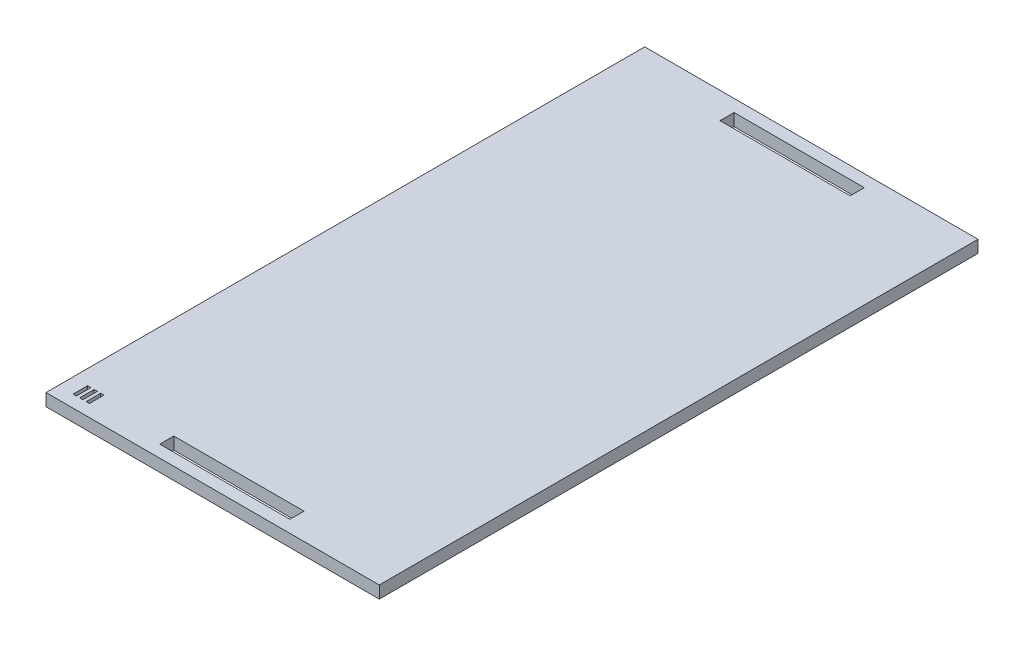
ISO-10303-21;
HEADER;
FILE_DESCRIPTION(('STEP AP214'),'2;1');
FILE_NAME('part.step','',(''),(''),'','','');
FILE_SCHEMA(('AUTOMOTIVE_DESIGN { 1 0 10303 214 1 1 1 1 }'));
ENDSEC;
DATA;
#1=APPLICATION_CONTEXT('core data for automotive mechanical design processes');
#2=APPLICATION_PROTOCOL_DEFINITION('international standard','automotive_design',2000,#1);
#3=PRODUCT_CONTEXT('',#1,'mechanical');
#4=PRODUCT('Part','Part','',(#3));
#5=PRODUCT_RELATED_PRODUCT_CATEGORY('part','',(#4));
#6=PRODUCT_DEFINITION_FORMATION('','',#4);
#7=PRODUCT_DEFINITION_CONTEXT('part definition',#1,'design');
#8=PRODUCT_DEFINITION('design','',#6,#7);
#9=PRODUCT_DEFINITION_SHAPE('','',#8);
#10=(LENGTH_UNIT() NAMED_UNIT(*) SI_UNIT(.MILLI.,.METRE.));
#11=(NAMED_UNIT(*) PLANE_ANGLE_UNIT() SI_UNIT($,.RADIAN.));
#12=(NAMED_UNIT(*) SI_UNIT($,.STERADIAN.) SOLID_ANGLE_UNIT());
#13=UNCERTAINTY_MEASURE_WITH_UNIT(LENGTH_MEASURE(1.E-05),#10,'distance_accuracy_value','');
#14=(GEOMETRIC_REPRESENTATION_CONTEXT(3) GLOBAL_UNCERTAINTY_ASSIGNED_CONTEXT((#13)) GLOBAL_UNIT_ASSIGNED_CONTEXT((#10,
#11,#12)) REPRESENTATION_CONTEXT('',''));
#15=CARTESIAN_POINT('',(0.,0.,0.));
#16=DIRECTION('',(0.,0.,1.));
#17=DIRECTION('',(1.,0.,0.));
#18=AXIS2_PLACEMENT_3D('',#15,#16,#17);
#19=CARTESIAN_POINT('',(0.,2.9972,66.4972));
#20=DIRECTION('',(0.,0.,-1.));
#21=DIRECTION('',(-1.,0.,0.));
#22=AXIS2_PLACEMENT_3D('',#19,#20,#21);
#23=PLANE('',#22);
#24=DIRECTION('',(1.,0.,0.));
#25=VECTOR('',#24,1.);
#26=CARTESIAN_POINT('',(0.,0.,66.4972));
#27=LINE('',#26,#25);
#28=CARTESIAN_POINT('',(-33.8386367698087,0.,66.4972));
#29=VERTEX_POINT('',#28);
#30=CARTESIAN_POINT('',(-33.0448867698086,0.,66.4972));
#31=VERTEX_POINT('',#30);
#32=EDGE_CURVE('E317',#29,#31,#27,.T.);
#33=ORIENTED_EDGE('',*,*,#32,.T.);
#34=DIRECTION('',(0.,-1.,0.));
#35=VECTOR('',#34,1.);
#36=CARTESIAN_POINT('',(-33.0448867698086,2.9972,66.4972));
#37=LINE('',#36,#35);
#38=CARTESIAN_POINT('',(-33.0448867698086,2.9972,66.4972));
#39=VERTEX_POINT('',#38);
#40=EDGE_CURVE('E11',#39,#31,#37,.T.);
#41=ORIENTED_EDGE('',*,*,#40,.F.);
#42=DIRECTION('',(1.,0.,0.));
#43=VECTOR('',#42,1.);
#44=CARTESIAN_POINT('',(0.,2.9972,66.4972));
#45=LINE('',#44,#43);
#46=CARTESIAN_POINT('',(-33.8386367698087,2.9972,66.4972));
#47=VERTEX_POINT('',#46);
#48=EDGE_CURVE('E217',#47,#39,#45,.T.);
#49=ORIENTED_EDGE('',*,*,#48,.F.);
#50=DIRECTION('',(0.,-1.,0.));
#51=VECTOR('',#50,1.);
#52=CARTESIAN_POINT('',(-33.8386367698087,2.9972,66.4972));
#53=LINE('',#52,#51);
#54=EDGE_CURVE('E61',#47,#29,#53,.T.);
#55=ORIENTED_EDGE('',*,*,#54,.T.);
#56=EDGE_LOOP('',(#33,#41,#49,#55));
#57=FACE_BOUND('',#56,.T.);
#58=ADVANCED_FACE('F41',(#57),#23,.F.);
#59=CARTESIAN_POINT('',(-33.0448867698086,2.9972,0.));
#60=DIRECTION('',(1.,0.,0.));
#61=DIRECTION('',(0.,0.,-1.));
#62=AXIS2_PLACEMENT_3D('',#59,#60,#61);
#63=PLANE('',#62);
#64=DIRECTION('',(0.,0.,1.));
#65=VECTOR('',#64,1.);
#66=CARTESIAN_POINT('',(-33.0448867698086,0.,0.));
#67=LINE('',#66,#65);
#68=CARTESIAN_POINT('',(-33.0448867698086,0.,70.0532));
#69=VERTEX_POINT('',#68);
#70=EDGE_CURVE('E224',#31,#69,#67,.T.);
#71=ORIENTED_EDGE('',*,*,#70,.T.);
#72=DIRECTION('',(0.,-1.,0.));
#73=VECTOR('',#72,1.);
#74=CARTESIAN_POINT('',(-33.0448867698086,2.9972,70.0532));
#75=LINE('',#74,#73);
#76=CARTESIAN_POINT('',(-33.0448867698086,2.9972,70.0532));
#77=VERTEX_POINT('',#76);
#78=EDGE_CURVE('E52',#77,#69,#75,.T.);
#79=ORIENTED_EDGE('',*,*,#78,.F.);
#80=DIRECTION('',(0.,0.,1.));
#81=VECTOR('',#80,1.);
#82=CARTESIAN_POINT('',(-33.0448867698086,2.9972,0.));
#83=LINE('',#82,#81);
#84=EDGE_CURVE('E211',#39,#77,#83,.T.);
#85=ORIENTED_EDGE('',*,*,#84,.F.);
#86=ORIENTED_EDGE('',*,*,#40,.T.);
#87=EDGE_LOOP('',(#71,#79,#85,#86));
#88=FACE_BOUND('',#87,.T.);
#89=ADVANCED_FACE('F223',(#88),#63,.F.);
#90=CARTESIAN_POINT('',(0.,2.9972,70.0532));
#91=DIRECTION('',(0.,0.,-1.));
#92=DIRECTION('',(-1.,0.,0.));
#93=AXIS2_PLACEMENT_3D('',#90,#91,#92);
#94=PLANE('',#93);
#95=DIRECTION('',(1.,0.,0.));
#96=VECTOR('',#95,1.);
#97=CARTESIAN_POINT('',(0.,0.,70.0532));
#98=LINE('',#97,#96);
#99=CARTESIAN_POINT('',(-33.8386367698087,0.,70.0532));
#100=VERTEX_POINT('',#99);
#101=EDGE_CURVE('E322',#100,#69,#98,.T.);
#102=ORIENTED_EDGE('',*,*,#101,.F.);
#103=DIRECTION('',(0.,-1.,0.));
#104=VECTOR('',#103,1.);
#105=CARTESIAN_POINT('',(-33.8386367698087,2.9972,70.0532));
#106=LINE('',#105,#104);
#107=CARTESIAN_POINT('',(-33.8386367698087,2.9972,70.0532));
#108=VERTEX_POINT('',#107);
#109=EDGE_CURVE('E135',#108,#100,#106,.T.);
#110=ORIENTED_EDGE('',*,*,#109,.F.);
#111=DIRECTION('',(1.,0.,0.));
#112=VECTOR('',#111,1.);
#113=CARTESIAN_POINT('',(0.,2.9972,70.0532));
#114=LINE('',#113,#112);
#115=EDGE_CURVE('E216',#108,#77,#114,.T.);
#116=ORIENTED_EDGE('',*,*,#115,.T.);
#117=ORIENTED_EDGE('',*,*,#78,.T.);
#118=EDGE_LOOP('',(#102,#110,#116,#117));
#119=FACE_BOUND('',#118,.T.);
#120=ADVANCED_FACE('F229',(#119),#94,.T.);
#121=CARTESIAN_POINT('',(0.,2.9972,66.4972));
#122=DIRECTION('',(0.,0.,-1.));
#123=DIRECTION('',(-1.,0.,0.));
#124=AXIS2_PLACEMENT_3D('',#121,#122,#123);
#125=PLANE('',#124);
#126=DIRECTION('',(1.,0.,0.));
#127=VECTOR('',#126,1.);
#128=CARTESIAN_POINT('',(0.,0.,66.4972));
#129=LINE('',#128,#127);
#130=CARTESIAN_POINT('',(-37.0136367698087,0.,66.4972));
#131=VERTEX_POINT('',#130);
#132=CARTESIAN_POINT('',(-36.2198867698087,0.,66.4972));
#133=VERTEX_POINT('',#132);
#134=EDGE_CURVE('E301',#131,#133,#129,.T.);
#135=ORIENTED_EDGE('',*,*,#134,.T.);
#136=DIRECTION('',(0.,-1.,0.));
#137=VECTOR('',#136,1.);
#138=CARTESIAN_POINT('',(-36.2198867698087,2.9972,66.4972));
#139=LINE('',#138,#137);
#140=CARTESIAN_POINT('',(-36.2198867698087,2.9972,66.4972));
#141=VERTEX_POINT('',#140);
#142=EDGE_CURVE('E332',#141,#133,#139,.T.);
#143=ORIENTED_EDGE('',*,*,#142,.F.);
#144=DIRECTION('',(1.,0.,0.));
#145=VECTOR('',#144,1.);
#146=CARTESIAN_POINT('',(0.,2.9972,66.4972));
#147=LINE('',#146,#145);
#148=CARTESIAN_POINT('',(-37.0136367698087,2.9972,66.4972));
#149=VERTEX_POINT('',#148);
#150=EDGE_CURVE('E467',#149,#141,#147,.T.);
#151=ORIENTED_EDGE('',*,*,#150,.F.);
#152=DIRECTION('',(0.,-1.,0.));
#153=VECTOR('',#152,1.);
#154=CARTESIAN_POINT('',(-37.0136367698087,2.9972,66.4972));
#155=LINE('',#154,#153);
#156=EDGE_CURVE('E335',#149,#131,#155,.T.);
#157=ORIENTED_EDGE('',*,*,#156,.T.);
#158=EDGE_LOOP('',(#135,#143,#151,#157));
#159=FACE_BOUND('',#158,.T.);
#160=ADVANCED_FACE('F498',(#159),#125,.F.);
#161=CARTESIAN_POINT('',(-36.2198867698087,2.9972,0.));
#162=DIRECTION('',(1.,0.,0.));
#163=DIRECTION('',(0.,0.,-1.));
#164=AXIS2_PLACEMENT_3D('',#161,#162,#163);
#165=PLANE('',#164);
#166=DIRECTION('',(0.,0.,1.));
#167=VECTOR('',#166,1.);
#168=CARTESIAN_POINT('',(-36.2198867698087,0.,0.));
#169=LINE('',#168,#167);
#170=CARTESIAN_POINT('',(-36.2198867698087,0.,70.0532));
#171=VERTEX_POINT('',#170);
#172=EDGE_CURVE('E305',#133,#171,#169,.T.);
#173=ORIENTED_EDGE('',*,*,#172,.T.);
#174=DIRECTION('',(0.,-1.,0.));
#175=VECTOR('',#174,1.);
#176=CARTESIAN_POINT('',(-36.2198867698087,2.9972,70.0532));
#177=LINE('',#176,#175);
#178=CARTESIAN_POINT('',(-36.2198867698087,2.9972,70.0532));
#179=VERTEX_POINT('',#178);
#180=EDGE_CURVE('E342',#179,#171,#177,.T.);
#181=ORIENTED_EDGE('',*,*,#180,.F.);
#182=DIRECTION('',(0.,0.,1.));
#183=VECTOR('',#182,1.);
#184=CARTESIAN_POINT('',(-36.2198867698087,2.9972,0.));
#185=LINE('',#184,#183);
#186=EDGE_CURVE('E471',#141,#179,#185,.T.);
#187=ORIENTED_EDGE('',*,*,#186,.F.);
#188=ORIENTED_EDGE('',*,*,#142,.T.);
#189=EDGE_LOOP('',(#173,#181,#187,#188));
#190=FACE_BOUND('',#189,.T.);
#191=ADVANCED_FACE('F500',(#190),#165,.F.);
#192=CARTESIAN_POINT('',(0.,2.9972,70.0532));
#193=DIRECTION('',(0.,0.,-1.));
#194=DIRECTION('',(-1.,0.,0.));
#195=AXIS2_PLACEMENT_3D('',#192,#193,#194);
#196=PLANE('',#195);
#197=DIRECTION('',(1.,0.,0.));
#198=VECTOR('',#197,1.);
#199=CARTESIAN_POINT('',(0.,0.,70.0532));
#200=LINE('',#199,#198);
#201=CARTESIAN_POINT('',(-37.0136367698087,0.,70.0532));
#202=VERTEX_POINT('',#201);
#203=EDGE_CURVE('E309',#202,#171,#200,.T.);
#204=ORIENTED_EDGE('',*,*,#203,.F.);
#205=DIRECTION('',(0.,-1.,0.));
#206=VECTOR('',#205,1.);
#207=CARTESIAN_POINT('',(-37.0136367698087,2.9972,70.0532));
#208=LINE('',#207,#206);
#209=CARTESIAN_POINT('',(-37.0136367698087,2.9972,70.0532));
#210=VERTEX_POINT('',#209);
#211=EDGE_CURVE('E338',#210,#202,#208,.T.);
#212=ORIENTED_EDGE('',*,*,#211,.F.);
#213=DIRECTION('',(1.,0.,0.));
#214=VECTOR('',#213,1.);
#215=CARTESIAN_POINT('',(0.,2.9972,70.0532));
#216=LINE('',#215,#214);
#217=EDGE_CURVE('E474',#210,#179,#216,.T.);
#218=ORIENTED_EDGE('',*,*,#217,.T.);
#219=ORIENTED_EDGE('',*,*,#180,.T.);
#220=EDGE_LOOP('',(#204,#212,#218,#219));
#221=FACE_BOUND('',#220,.T.);
#222=ADVANCED_FACE('F493',(#221),#196,.T.);
#223=CARTESIAN_POINT('',(0.,2.9972,66.6242));
#224=DIRECTION('',(0.,0.,-1.));
#225=DIRECTION('',(-1.,0.,0.));
#226=AXIS2_PLACEMENT_3D('',#223,#224,#225);
#227=PLANE('',#226);
#228=DIRECTION('',(1.,0.,0.));
#229=VECTOR('',#228,1.);
#230=CARTESIAN_POINT('',(0.,0.,66.6242));
#231=LINE('',#230,#229);
#232=CARTESIAN_POINT('',(-15.875,0.,66.6242));
#233=VERTEX_POINT('',#232);
#234=CARTESIAN_POINT('',(15.875,0.,66.6242));
#235=VERTEX_POINT('',#234);
#236=EDGE_CURVE('E285',#233,#235,#231,.T.);
#237=ORIENTED_EDGE('',*,*,#236,.T.);
#238=DIRECTION('',(0.,-1.,0.));
#239=VECTOR('',#238,1.);
#240=CARTESIAN_POINT('',(15.875,2.9972,66.6242));
#241=LINE('',#240,#239);
#242=CARTESIAN_POINT('',(15.875,2.9972,66.6242));
#243=VERTEX_POINT('',#242);
#244=EDGE_CURVE('E339',#243,#235,#241,.T.);
#245=ORIENTED_EDGE('',*,*,#244,.F.);
#246=DIRECTION('',(1.,0.,0.));
#247=VECTOR('',#246,1.);
#248=CARTESIAN_POINT('',(0.,2.9972,66.6242));
#249=LINE('',#248,#247);
#250=CARTESIAN_POINT('',(-15.875,2.9972,66.6242));
#251=VERTEX_POINT('',#250);
#252=EDGE_CURVE('E452',#251,#243,#249,.T.);
#253=ORIENTED_EDGE('',*,*,#252,.F.);
#254=DIRECTION('',(0.,-1.,0.));
#255=VECTOR('',#254,1.);
#256=CARTESIAN_POINT('',(-15.875,2.9972,66.6242));
#257=LINE('',#256,#255);
#258=EDGE_CURVE('E348',#251,#233,#257,.T.);
#259=ORIENTED_EDGE('',*,*,#258,.T.);
#260=EDGE_LOOP('',(#237,#245,#253,#259));
#261=FACE_BOUND('',#260,.T.);
#262=ADVANCED_FACE('F507',(#261),#227,.F.);
#263=CARTESIAN_POINT('',(15.8750000000001,2.9972,0.));
#264=DIRECTION('',(1.,0.,0.));
#265=DIRECTION('',(0.,0.,-1.));
#266=AXIS2_PLACEMENT_3D('',#263,#264,#265);
#267=PLANE('',#266);
#268=DIRECTION('',(0.,0.,1.));
#269=VECTOR('',#268,1.);
#270=CARTESIAN_POINT('',(15.8750000000001,0.,0.));
#271=LINE('',#270,#269);
#272=CARTESIAN_POINT('',(15.875,0.,70.0532));
#273=VERTEX_POINT('',#272);
#274=EDGE_CURVE('E289',#235,#273,#271,.T.);
#275=ORIENTED_EDGE('',*,*,#274,.T.);
#276=DIRECTION('',(0.,-1.,0.));
#277=VECTOR('',#276,1.);
#278=CARTESIAN_POINT('',(15.875,2.9972,70.0532));
#279=LINE('',#278,#277);
#280=CARTESIAN_POINT('',(15.875,2.9972,70.0532));
#281=VERTEX_POINT('',#280);
#282=EDGE_CURVE('E355',#281,#273,#279,.T.);
#283=ORIENTED_EDGE('',*,*,#282,.F.);
#284=DIRECTION('',(0.,0.,1.));
#285=VECTOR('',#284,1.);
#286=CARTESIAN_POINT('',(15.8750000000001,2.9972,0.));
#287=LINE('',#286,#285);
#288=EDGE_CURVE('E456',#243,#281,#287,.T.);
#289=ORIENTED_EDGE('',*,*,#288,.F.);
#290=ORIENTED_EDGE('',*,*,#244,.T.);
#291=EDGE_LOOP('',(#275,#283,#289,#290));
#292=FACE_BOUND('',#291,.T.);
#293=ADVANCED_FACE('F569',(#292),#267,.F.);
#294=CARTESIAN_POINT('',(0.,2.9972,70.0532));
#295=DIRECTION('',(0.,0.,-1.));
#296=DIRECTION('',(-1.,0.,0.));
#297=AXIS2_PLACEMENT_3D('',#294,#295,#296);
#298=PLANE('',#297);
#299=DIRECTION('',(1.,0.,0.));
#300=VECTOR('',#299,1.);
#301=CARTESIAN_POINT('',(0.,0.,70.0532));
#302=LINE('',#301,#300);
#303=CARTESIAN_POINT('',(-15.875,0.,70.0532));
#304=VERTEX_POINT('',#303);
#305=EDGE_CURVE('E293',#304,#273,#302,.T.);
#306=ORIENTED_EDGE('',*,*,#305,.F.);
#307=DIRECTION('',(0.,-1.,0.));
#308=VECTOR('',#307,1.);
#309=CARTESIAN_POINT('',(-15.875,2.9972,70.0532));
#310=LINE('',#309,#308);
#311=CARTESIAN_POINT('',(-15.875,2.9972,70.0532));
#312=VERTEX_POINT('',#311);
#313=EDGE_CURVE('E351',#312,#304,#310,.T.);
#314=ORIENTED_EDGE('',*,*,#313,.F.);
#315=DIRECTION('',(1.,0.,0.));
#316=VECTOR('',#315,1.);
#317=CARTESIAN_POINT('',(0.,2.9972,70.0532));
#318=LINE('',#317,#316);
#319=EDGE_CURVE('E459',#312,#281,#318,.T.);
#320=ORIENTED_EDGE('',*,*,#319,.T.);
#321=ORIENTED_EDGE('',*,*,#282,.T.);
#322=EDGE_LOOP('',(#306,#314,#320,#321));
#323=FACE_BOUND('',#322,.T.);
#324=ADVANCED_FACE('F556',(#323),#298,.T.);
#325=CARTESIAN_POINT('',(0.,2.9972,-70.0532));
#326=DIRECTION('',(0.,0.,-1.));
#327=DIRECTION('',(-1.,0.,0.));
#328=AXIS2_PLACEMENT_3D('',#325,#326,#327);
#329=PLANE('',#328);
#330=DIRECTION('',(1.,0.,0.));
#331=VECTOR('',#330,1.);
#332=CARTESIAN_POINT('',(0.,0.,-70.0532));
#333=LINE('',#332,#331);
#334=CARTESIAN_POINT('',(-15.875,0.,-70.0532));
#335=VERTEX_POINT('',#334);
#336=CARTESIAN_POINT('',(15.875,0.,-70.0532));
#337=VERTEX_POINT('',#336);
#338=EDGE_CURVE('E269',#335,#337,#333,.T.);
#339=ORIENTED_EDGE('',*,*,#338,.T.);
#340=DIRECTION('',(0.,-1.,0.));
#341=VECTOR('',#340,1.);
#342=CARTESIAN_POINT('',(15.875,2.9972,-70.0532));
#343=LINE('',#342,#341);
#344=CARTESIAN_POINT('',(15.875,2.9972,-70.0532));
#345=VERTEX_POINT('',#344);
#346=EDGE_CURVE('E352',#345,#337,#343,.T.);
#347=ORIENTED_EDGE('',*,*,#346,.F.);
#348=DIRECTION('',(1.,0.,0.));
#349=VECTOR('',#348,1.);
#350=CARTESIAN_POINT('',(0.,2.9972,-70.0532));
#351=LINE('',#350,#349);
#352=CARTESIAN_POINT('',(-15.875,2.9972,-70.0532));
#353=VERTEX_POINT('',#352);
#354=EDGE_CURVE('E437',#353,#345,#351,.T.);
#355=ORIENTED_EDGE('',*,*,#354,.F.);
#356=DIRECTION('',(0.,-1.,0.));
#357=VECTOR('',#356,1.);
#358=CARTESIAN_POINT('',(-15.875,2.9972,-70.0532));
#359=LINE('',#358,#357);
#360=EDGE_CURVE('E361',#353,#335,#359,.T.);
#361=ORIENTED_EDGE('',*,*,#360,.T.);
#362=EDGE_LOOP('',(#339,#347,#355,#361));
#363=FACE_BOUND('',#362,.T.);
#364=ADVANCED_FACE('F552',(#363),#329,.F.);
#365=CARTESIAN_POINT('',(15.875,2.9972,0.));
#366=DIRECTION('',(1.,0.,0.));
#367=DIRECTION('',(0.,0.,-1.));
#368=AXIS2_PLACEMENT_3D('',#365,#366,#367);
#369=PLANE('',#368);
#370=DIRECTION('',(0.,0.,1.));
#371=VECTOR('',#370,1.);
#372=CARTESIAN_POINT('',(15.875,0.,0.));
#373=LINE('',#372,#371);
#374=CARTESIAN_POINT('',(15.875,0.,-66.6242));
#375=VERTEX_POINT('',#374);
#376=EDGE_CURVE('E273',#337,#375,#373,.T.);
#377=ORIENTED_EDGE('',*,*,#376,.T.);
#378=DIRECTION('',(0.,-1.,0.));
#379=VECTOR('',#378,1.);
#380=CARTESIAN_POINT('',(15.875,2.9972,-66.6242));
#381=LINE('',#380,#379);
#382=CARTESIAN_POINT('',(15.875,2.9972,-66.6242));
#383=VERTEX_POINT('',#382);
#384=EDGE_CURVE('E368',#383,#375,#381,.T.);
#385=ORIENTED_EDGE('',*,*,#384,.F.);
#386=DIRECTION('',(0.,0.,1.));
#387=VECTOR('',#386,1.);
#388=CARTESIAN_POINT('',(15.875,2.9972,0.));
#389=LINE('',#388,#387);
#390=EDGE_CURVE('E441',#345,#383,#389,.T.);
#391=ORIENTED_EDGE('',*,*,#390,.F.);
#392=ORIENTED_EDGE('',*,*,#346,.T.);
#393=EDGE_LOOP('',(#377,#385,#391,#392));
#394=FACE_BOUND('',#393,.T.);
#395=ADVANCED_FACE('F555',(#394),#369,.F.);
#396=CARTESIAN_POINT('',(0.,2.9972,-66.6242));
#397=DIRECTION('',(0.,0.,-1.));
#398=DIRECTION('',(-1.,0.,0.));
#399=AXIS2_PLACEMENT_3D('',#396,#397,#398);
#400=PLANE('',#399);
#401=DIRECTION('',(1.,0.,0.));
#402=VECTOR('',#401,1.);
#403=CARTESIAN_POINT('',(0.,0.,-66.6242));
#404=LINE('',#403,#402);
#405=CARTESIAN_POINT('',(-15.875,0.,-66.6242));
#406=VERTEX_POINT('',#405);
#407=EDGE_CURVE('E277',#406,#375,#404,.T.);
#408=ORIENTED_EDGE('',*,*,#407,.F.);
#409=DIRECTION('',(0.,-1.,0.));
#410=VECTOR('',#409,1.);
#411=CARTESIAN_POINT('',(-15.875,2.9972,-66.6242));
#412=LINE('',#411,#410);
#413=CARTESIAN_POINT('',(-15.875,2.9972,-66.6242));
#414=VERTEX_POINT('',#413);
#415=EDGE_CURVE('E364',#414,#406,#412,.T.);
#416=ORIENTED_EDGE('',*,*,#415,.F.);
#417=DIRECTION('',(1.,0.,0.));
#418=VECTOR('',#417,1.);
#419=CARTESIAN_POINT('',(0.,2.9972,-66.6242));
#420=LINE('',#419,#418);
#421=EDGE_CURVE('E444',#414,#383,#420,.T.);
#422=ORIENTED_EDGE('',*,*,#421,.T.);
#423=ORIENTED_EDGE('',*,*,#384,.T.);
#424=EDGE_LOOP('',(#408,#416,#422,#423));
#425=FACE_BOUND('',#424,.T.);
#426=ADVANCED_FACE('F540',(#425),#400,.T.);
#427=CARTESIAN_POINT('',(-40.6471374,2.9972,0.));
#428=DIRECTION('',(-1.,0.,0.));
#429=DIRECTION('',(0.,0.,1.));
#430=AXIS2_PLACEMENT_3D('',#427,#428,#429);
#431=PLANE('',#430);
#432=DIRECTION('',(0.,0.,-1.));
#433=VECTOR('',#432,1.);
#434=CARTESIAN_POINT('',(-40.6471374,0.,0.));
#435=LINE('',#434,#433);
#436=CARTESIAN_POINT('',(-40.6471374,0.,73.025));
#437=VERTEX_POINT('',#436);
#438=CARTESIAN_POINT('',(-40.6471374,0.,-73.025));
#439=VERTEX_POINT('',#438);
#440=EDGE_CURVE('E253',#437,#439,#435,.T.);
#441=ORIENTED_EDGE('',*,*,#440,.F.);
#442=DIRECTION('',(0.,-1.,0.));
#443=VECTOR('',#442,1.);
#444=CARTESIAN_POINT('',(-40.6471374,2.9972,73.025));
#445=LINE('',#444,#443);
#446=CARTESIAN_POINT('',(-40.6471374,2.9972,73.025));
#447=VERTEX_POINT('',#446);
#448=EDGE_CURVE('E365',#447,#437,#445,.T.);
#449=ORIENTED_EDGE('',*,*,#448,.F.);
#450=DIRECTION('',(0.,0.,-1.));
#451=VECTOR('',#450,1.);
#452=CARTESIAN_POINT('',(-40.6471374,2.9972,0.));
#453=LINE('',#452,#451);
#454=CARTESIAN_POINT('',(-40.6471374,2.9972,-73.025));
#455=VERTEX_POINT('',#454);
#456=EDGE_CURVE('E416',#447,#455,#453,.T.);
#457=ORIENTED_EDGE('',*,*,#456,.T.);
#458=DIRECTION('',(0.,-1.,0.));
#459=VECTOR('',#458,1.);
#460=CARTESIAN_POINT('',(-40.6471374,2.9972,-73.025));
#461=LINE('',#460,#459);
#462=EDGE_CURVE('E374',#455,#439,#461,.T.);
#463=ORIENTED_EDGE('',*,*,#462,.T.);
#464=EDGE_LOOP('',(#441,#449,#457,#463));
#465=FACE_BOUND('',#464,.T.);
#466=ADVANCED_FACE('F536',(#465),#431,.T.);
#467=CARTESIAN_POINT('',(0.,2.9972,73.025));
#468=DIRECTION('',(0.,0.,1.));
#469=DIRECTION('',(1.,0.,0.));
#470=AXIS2_PLACEMENT_3D('',#467,#468,#469);
#471=PLANE('',#470);
#472=DIRECTION('',(-1.,0.,0.));
#473=VECTOR('',#472,1.);
#474=CARTESIAN_POINT('',(0.,0.,73.025));
#475=LINE('',#474,#473);
#476=CARTESIAN_POINT('',(40.6471374,0.,73.025));
#477=VERTEX_POINT('',#476);
#478=EDGE_CURVE('E257',#477,#437,#475,.T.);
#479=ORIENTED_EDGE('',*,*,#478,.F.);
#480=DIRECTION('',(0.,-1.,0.));
#481=VECTOR('',#480,1.);
#482=CARTESIAN_POINT('',(40.6471374,2.9972,73.025));
#483=LINE('',#482,#481);
#484=CARTESIAN_POINT('',(40.6471374,2.9972,73.025));
#485=VERTEX_POINT('',#484);
#486=EDGE_CURVE('E381',#485,#477,#483,.T.);
#487=ORIENTED_EDGE('',*,*,#486,.F.);
#488=DIRECTION('',(-1.,0.,0.));
#489=VECTOR('',#488,1.);
#490=CARTESIAN_POINT('',(0.,2.9972,73.025));
#491=LINE('',#490,#489);
#492=EDGE_CURVE('E422',#485,#447,#491,.T.);
#493=ORIENTED_EDGE('',*,*,#492,.T.);
#494=ORIENTED_EDGE('',*,*,#448,.T.);
#495=EDGE_LOOP('',(#479,#487,#493,#494));
#496=FACE_BOUND('',#495,.T.);
#497=ADVANCED_FACE('F539',(#496),#471,.T.);
#498=CARTESIAN_POINT('',(40.6471374,2.9972,0.));
#499=DIRECTION('',(-1.,0.,0.));
#500=DIRECTION('',(0.,0.,1.));
#501=AXIS2_PLACEMENT_3D('',#498,#499,#500);
#502=PLANE('',#501);
#503=DIRECTION('',(0.,0.,-1.));
#504=VECTOR('',#503,1.);
#505=CARTESIAN_POINT('',(40.6471374,0.,0.));
#506=LINE('',#505,#504);
#507=CARTESIAN_POINT('',(40.6471374,0.,-73.025));
#508=VERTEX_POINT('',#507);
#509=EDGE_CURVE('E261',#477,#508,#506,.T.);
#510=ORIENTED_EDGE('',*,*,#509,.T.);
#511=DIRECTION('',(0.,-1.,0.));
#512=VECTOR('',#511,1.);
#513=CARTESIAN_POINT('',(40.6471374,2.9972,-73.025));
#514=LINE('',#513,#512);
#515=CARTESIAN_POINT('',(40.6471374,2.9972,-73.025));
#516=VERTEX_POINT('',#515);
#517=EDGE_CURVE('E377',#516,#508,#514,.T.);
#518=ORIENTED_EDGE('',*,*,#517,.F.);
#519=DIRECTION('',(0.,0.,-1.));
#520=VECTOR('',#519,1.);
#521=CARTESIAN_POINT('',(40.6471374,2.9972,0.));
#522=LINE('',#521,#520);
#523=EDGE_CURVE('E430',#485,#516,#522,.T.);
#524=ORIENTED_EDGE('',*,*,#523,.F.);
#525=ORIENTED_EDGE('',*,*,#486,.T.);
#526=EDGE_LOOP('',(#510,#518,#524,#525));
#527=FACE_BOUND('',#526,.T.);
#528=ADVANCED_FACE('F544',(#527),#502,.F.);
#529=CARTESIAN_POINT('',(-34.6323867698087,2.9972,0.));
#530=DIRECTION('',(-1.,0.,0.));
#531=DIRECTION('',(0.,0.,1.));
#532=AXIS2_PLACEMENT_3D('',#529,#530,#531);
#533=PLANE('',#532);
#534=DIRECTION('',(0.,0.,-1.));
#535=VECTOR('',#534,1.);
#536=CARTESIAN_POINT('',(-34.6323867698087,0.,0.));
#537=LINE('',#536,#535);
#538=CARTESIAN_POINT('',(-34.6323867698087,0.,70.0532));
#539=VERTEX_POINT('',#538);
#540=CARTESIAN_POINT('',(-34.6323867698087,0.,66.4972));
#541=VERTEX_POINT('',#540);
#542=EDGE_CURVE('E238',#539,#541,#537,.T.);
#543=ORIENTED_EDGE('',*,*,#542,.F.);
#544=DIRECTION('',(0.,-1.,0.));
#545=VECTOR('',#544,1.);
#546=CARTESIAN_POINT('',(-34.6323867698087,2.9972,70.0532));
#547=LINE('',#546,#545);
#548=CARTESIAN_POINT('',(-34.6323867698087,2.9972,70.0532));
#549=VERTEX_POINT('',#548);
#550=EDGE_CURVE('E45',#549,#539,#547,.T.);
#551=ORIENTED_EDGE('',*,*,#550,.F.);
#552=DIRECTION('',(0.,0.,-1.));
#553=VECTOR('',#552,1.);
#554=CARTESIAN_POINT('',(-34.6323867698087,2.9972,0.));
#555=LINE('',#554,#553);
#556=CARTESIAN_POINT('',(-34.6323867698087,2.9972,66.4972));
#557=VERTEX_POINT('',#556);
#558=EDGE_CURVE('E329',#549,#557,#555,.T.);
#559=ORIENTED_EDGE('',*,*,#558,.T.);
#560=DIRECTION('',(0.,-1.,0.));
#561=VECTOR('',#560,1.);
#562=CARTESIAN_POINT('',(-34.6323867698087,2.9972,66.4972));
#563=LINE('',#562,#561);
#564=EDGE_CURVE('E234',#557,#541,#563,.T.);
#565=ORIENTED_EDGE('',*,*,#564,.T.);
#566=EDGE_LOOP('',(#543,#551,#559,#565));
#567=FACE_BOUND('',#566,.T.);
#568=ADVANCED_FACE('F43',(#567),#533,.T.);
#569=CARTESIAN_POINT('',(0.,2.9972,70.0532));
#570=DIRECTION('',(0.,0.,-1.));
#571=DIRECTION('',(-1.,0.,0.));
#572=AXIS2_PLACEMENT_3D('',#569,#570,#571);
#573=PLANE('',#572);
#574=DIRECTION('',(1.,0.,0.));
#575=VECTOR('',#574,1.);
#576=CARTESIAN_POINT('',(0.,0.,70.0532));
#577=LINE('',#576,#575);
#578=CARTESIAN_POINT('',(-35.4261367698087,0.,70.0532));
#579=VERTEX_POINT('',#578);
#580=EDGE_CURVE('E242',#579,#539,#577,.T.);
#581=ORIENTED_EDGE('',*,*,#580,.F.);
#582=DIRECTION('',(0.,-1.,0.));
#583=VECTOR('',#582,1.);
#584=CARTESIAN_POINT('',(-35.4261367698087,2.9972,70.0532));
#585=LINE('',#584,#583);
#586=CARTESIAN_POINT('',(-35.4261367698087,2.9972,70.0532));
#587=VERTEX_POINT('',#586);
#588=EDGE_CURVE('E391',#587,#579,#585,.T.);
#589=ORIENTED_EDGE('',*,*,#588,.F.);
#590=DIRECTION('',(1.,0.,0.));
#591=VECTOR('',#590,1.);
#592=CARTESIAN_POINT('',(0.,2.9972,70.0532));
#593=LINE('',#592,#591);
#594=EDGE_CURVE('E402',#587,#549,#593,.T.);
#595=ORIENTED_EDGE('',*,*,#594,.T.);
#596=ORIENTED_EDGE('',*,*,#550,.T.);
#597=EDGE_LOOP('',(#581,#589,#595,#596));
#598=FACE_BOUND('',#597,.T.);
#599=ADVANCED_FACE('F400',(#598),#573,.T.);
#600=CARTESIAN_POINT('',(-35.4261367698087,2.9972,0.));
#601=DIRECTION('',(-1.,0.,0.));
#602=DIRECTION('',(0.,0.,1.));
#603=AXIS2_PLACEMENT_3D('',#600,#601,#602);
#604=PLANE('',#603);
#605=DIRECTION('',(0.,0.,-1.));
#606=VECTOR('',#605,1.);
#607=CARTESIAN_POINT('',(-35.4261367698087,0.,0.));
#608=LINE('',#607,#606);
#609=CARTESIAN_POINT('',(-35.4261367698087,0.,66.4972));
#610=VERTEX_POINT('',#609);
#611=EDGE_CURVE('E246',#579,#610,#608,.T.);
#612=ORIENTED_EDGE('',*,*,#611,.T.);
#613=DIRECTION('',(0.,-1.,0.));
#614=VECTOR('',#613,1.);
#615=CARTESIAN_POINT('',(-35.4261367698087,2.9972,66.4972));
#616=LINE('',#615,#614);
#617=CARTESIAN_POINT('',(-35.4261367698087,2.9972,66.4972));
#618=VERTEX_POINT('',#617);
#619=EDGE_CURVE('E388',#618,#610,#616,.T.);
#620=ORIENTED_EDGE('',*,*,#619,.F.);
#621=DIRECTION('',(0.,0.,-1.));
#622=VECTOR('',#621,1.);
#623=CARTESIAN_POINT('',(-35.4261367698087,2.9972,0.));
#624=LINE('',#623,#622);
#625=EDGE_CURVE('E417',#587,#618,#624,.T.);
#626=ORIENTED_EDGE('',*,*,#625,.F.);
#627=ORIENTED_EDGE('',*,*,#588,.T.);
#628=EDGE_LOOP('',(#612,#620,#626,#627));
#629=FACE_BOUND('',#628,.T.);
#630=ADVANCED_FACE('F409',(#629),#604,.F.);
#631=CARTESIAN_POINT('',(-37.0136367698087,2.9972,0.));
#632=DIRECTION('',(1.,0.,0.));
#633=DIRECTION('',(0.,0.,-1.));
#634=AXIS2_PLACEMENT_3D('',#631,#632,#633);
#635=PLANE('',#634);
#636=DIRECTION('',(0.,0.,1.));
#637=VECTOR('',#636,1.);
#638=CARTESIAN_POINT('',(-37.0136367698087,0.,0.));
#639=LINE('',#638,#637);
#640=EDGE_CURVE('E313',#131,#202,#639,.T.);
#641=ORIENTED_EDGE('',*,*,#640,.F.);
#642=ORIENTED_EDGE('',*,*,#156,.F.);
#643=DIRECTION('',(0.,0.,1.));
#644=VECTOR('',#643,1.);
#645=CARTESIAN_POINT('',(-37.0136367698087,2.9972,0.));
#646=LINE('',#645,#644);
#647=EDGE_CURVE('E478',#149,#210,#646,.T.);
#648=ORIENTED_EDGE('',*,*,#647,.T.);
#649=ORIENTED_EDGE('',*,*,#211,.T.);
#650=EDGE_LOOP('',(#641,#642,#648,#649));
#651=FACE_BOUND('',#650,.T.);
#652=ADVANCED_FACE('F485',(#651),#635,.T.);
#653=CARTESIAN_POINT('',(-15.8750000000001,2.9972,0.));
#654=DIRECTION('',(1.,0.,0.));
#655=DIRECTION('',(0.,0.,-1.));
#656=AXIS2_PLACEMENT_3D('',#653,#654,#655);
#657=PLANE('',#656);
#658=DIRECTION('',(0.,0.,1.));
#659=VECTOR('',#658,1.);
#660=CARTESIAN_POINT('',(-15.8750000000001,0.,0.));
#661=LINE('',#660,#659);
#662=EDGE_CURVE('E297',#233,#304,#661,.T.);
#663=ORIENTED_EDGE('',*,*,#662,.F.);
#664=ORIENTED_EDGE('',*,*,#258,.F.);
#665=DIRECTION('',(0.,0.,1.));
#666=VECTOR('',#665,1.);
#667=CARTESIAN_POINT('',(-15.8750000000001,2.9972,0.));
#668=LINE('',#667,#666);
#669=EDGE_CURVE('E463',#251,#312,#668,.T.);
#670=ORIENTED_EDGE('',*,*,#669,.T.);
#671=ORIENTED_EDGE('',*,*,#313,.T.);
#672=EDGE_LOOP('',(#663,#664,#670,#671));
#673=FACE_BOUND('',#672,.T.);
#674=ADVANCED_FACE('F519',(#673),#657,.T.);
#675=CARTESIAN_POINT('',(-15.875,2.9972,0.));
#676=DIRECTION('',(1.,0.,0.));
#677=DIRECTION('',(0.,0.,-1.));
#678=AXIS2_PLACEMENT_3D('',#675,#676,#677);
#679=PLANE('',#678);
#680=DIRECTION('',(0.,0.,1.));
#681=VECTOR('',#680,1.);
#682=CARTESIAN_POINT('',(-15.875,0.,0.));
#683=LINE('',#682,#681);
#684=EDGE_CURVE('E281',#335,#406,#683,.T.);
#685=ORIENTED_EDGE('',*,*,#684,.F.);
#686=ORIENTED_EDGE('',*,*,#360,.F.);
#687=DIRECTION('',(0.,0.,1.));
#688=VECTOR('',#687,1.);
#689=CARTESIAN_POINT('',(-15.875,2.9972,0.));
#690=LINE('',#689,#688);
#691=EDGE_CURVE('E448',#353,#414,#690,.T.);
#692=ORIENTED_EDGE('',*,*,#691,.T.);
#693=ORIENTED_EDGE('',*,*,#415,.T.);
#694=EDGE_LOOP('',(#685,#686,#692,#693));
#695=FACE_BOUND('',#694,.T.);
#696=ADVANCED_FACE('F524',(#695),#679,.T.);
#697=CARTESIAN_POINT('',(0.,2.9972,-73.025));
#698=DIRECTION('',(0.,0.,1.));
#699=DIRECTION('',(1.,0.,0.));
#700=AXIS2_PLACEMENT_3D('',#697,#698,#699);
#701=PLANE('',#700);
#702=DIRECTION('',(-1.,0.,0.));
#703=VECTOR('',#702,1.);
#704=CARTESIAN_POINT('',(0.,0.,-73.025));
#705=LINE('',#704,#703);
#706=EDGE_CURVE('E265',#508,#439,#705,.T.);
#707=ORIENTED_EDGE('',*,*,#706,.T.);
#708=ORIENTED_EDGE('',*,*,#462,.F.);
#709=DIRECTION('',(-1.,0.,0.));
#710=VECTOR('',#709,1.);
#711=CARTESIAN_POINT('',(0.,2.9972,-73.025));
#712=LINE('',#711,#710);
#713=EDGE_CURVE('E434',#516,#455,#712,.T.);
#714=ORIENTED_EDGE('',*,*,#713,.F.);
#715=ORIENTED_EDGE('',*,*,#517,.T.);
#716=EDGE_LOOP('',(#707,#708,#714,#715));
#717=FACE_BOUND('',#716,.T.);
#718=ADVANCED_FACE('F535',(#717),#701,.F.);
#719=CARTESIAN_POINT('',(0.,2.9972,66.4972));
#720=DIRECTION('',(0.,0.,-1.));
#721=DIRECTION('',(-1.,0.,0.));
#722=AXIS2_PLACEMENT_3D('',#719,#720,#721);
#723=PLANE('',#722);
#724=DIRECTION('',(1.,0.,0.));
#725=VECTOR('',#724,1.);
#726=CARTESIAN_POINT('',(0.,0.,66.4972));
#727=LINE('',#726,#725);
#728=EDGE_CURVE('E249',#610,#541,#727,.T.);
#729=ORIENTED_EDGE('',*,*,#728,.T.);
#730=ORIENTED_EDGE('',*,*,#564,.F.);
#731=DIRECTION('',(1.,0.,0.));
#732=VECTOR('',#731,1.);
#733=CARTESIAN_POINT('',(0.,2.9972,66.4972));
#734=LINE('',#733,#732);
#735=EDGE_CURVE('E413',#618,#557,#734,.T.);
#736=ORIENTED_EDGE('',*,*,#735,.F.);
#737=ORIENTED_EDGE('',*,*,#619,.T.);
#738=EDGE_LOOP('',(#729,#730,#736,#737));
#739=FACE_BOUND('',#738,.T.);
#740=ADVANCED_FACE('F412',(#739),#723,.F.);
#741=CARTESIAN_POINT('',(-33.8386367698087,2.9972,0.));
#742=DIRECTION('',(1.,0.,0.));
#743=DIRECTION('',(0.,0.,-1.));
#744=AXIS2_PLACEMENT_3D('',#741,#742,#743);
#745=PLANE('',#744);
#746=DIRECTION('',(0.,0.,1.));
#747=VECTOR('',#746,1.);
#748=CARTESIAN_POINT('',(-33.8386367698087,0.,0.));
#749=LINE('',#748,#747);
#750=EDGE_CURVE('E325',#29,#100,#749,.T.);
#751=ORIENTED_EDGE('',*,*,#750,.F.);
#752=ORIENTED_EDGE('',*,*,#54,.F.);
#753=DIRECTION('',(0.,0.,1.));
#754=VECTOR('',#753,1.);
#755=CARTESIAN_POINT('',(-33.8386367698087,2.9972,0.));
#756=LINE('',#755,#754);
#757=EDGE_CURVE('E231',#47,#108,#756,.T.);
#758=ORIENTED_EDGE('',*,*,#757,.T.);
#759=ORIENTED_EDGE('',*,*,#109,.T.);
#760=EDGE_LOOP('',(#751,#752,#758,#759));
#761=FACE_BOUND('',#760,.T.);
#762=ADVANCED_FACE('F534',(#761),#745,.T.);
#763=CARTESIAN_POINT('',(0.,2.9972,0.));
#764=DIRECTION('',(0.,1.,0.));
#765=DIRECTION('',(0.,0.,1.));
#766=AXIS2_PLACEMENT_3D('',#763,#764,#765);
#767=PLANE('',#766);
#768=ORIENTED_EDGE('',*,*,#558,.F.);
#769=ORIENTED_EDGE('',*,*,#594,.F.);
#770=ORIENTED_EDGE('',*,*,#625,.T.);
#771=ORIENTED_EDGE('',*,*,#735,.T.);
#772=EDGE_LOOP('',(#768,#769,#770,#771));
#773=FACE_BOUND('',#772,.T.);
#774=ORIENTED_EDGE('',*,*,#456,.F.);
#775=ORIENTED_EDGE('',*,*,#492,.F.);
#776=ORIENTED_EDGE('',*,*,#523,.T.);
#777=ORIENTED_EDGE('',*,*,#713,.T.);
#778=EDGE_LOOP('',(#774,#775,#776,#777));
#779=FACE_BOUND('',#778,.T.);
#780=ORIENTED_EDGE('',*,*,#354,.T.);
#781=ORIENTED_EDGE('',*,*,#390,.T.);
#782=ORIENTED_EDGE('',*,*,#421,.F.);
#783=ORIENTED_EDGE('',*,*,#691,.F.);
#784=EDGE_LOOP('',(#780,#781,#782,#783));
#785=FACE_BOUND('',#784,.T.);
#786=ORIENTED_EDGE('',*,*,#252,.T.);
#787=ORIENTED_EDGE('',*,*,#288,.T.);
#788=ORIENTED_EDGE('',*,*,#319,.F.);
#789=ORIENTED_EDGE('',*,*,#669,.F.);
#790=EDGE_LOOP('',(#786,#787,#788,#789));
#791=FACE_BOUND('',#790,.T.);
#792=ORIENTED_EDGE('',*,*,#150,.T.);
#793=ORIENTED_EDGE('',*,*,#186,.T.);
#794=ORIENTED_EDGE('',*,*,#217,.F.);
#795=ORIENTED_EDGE('',*,*,#647,.F.);
#796=EDGE_LOOP('',(#792,#793,#794,#795));
#797=FACE_BOUND('',#796,.T.);
#798=ORIENTED_EDGE('',*,*,#48,.T.);
#799=ORIENTED_EDGE('',*,*,#84,.T.);
#800=ORIENTED_EDGE('',*,*,#115,.F.);
#801=ORIENTED_EDGE('',*,*,#757,.F.);
#802=EDGE_LOOP('',(#798,#799,#800,#801));
#803=FACE_BOUND('',#802,.T.);
#804=ADVANCED_FACE('F213',(#773,#779,#785,#791,#797,#803),#767,.T.);
#805=CARTESIAN_POINT('',(0.,0.,0.));
#806=DIRECTION('',(0.,1.,0.));
#807=DIRECTION('',(0.,0.,1.));
#808=AXIS2_PLACEMENT_3D('',#805,#806,#807);
#809=PLANE('',#808);
#810=ORIENTED_EDGE('',*,*,#542,.T.);
#811=ORIENTED_EDGE('',*,*,#728,.F.);
#812=ORIENTED_EDGE('',*,*,#611,.F.);
#813=ORIENTED_EDGE('',*,*,#580,.T.);
#814=EDGE_LOOP('',(#810,#811,#812,#813));
#815=FACE_BOUND('',#814,.T.);
#816=ORIENTED_EDGE('',*,*,#440,.T.);
#817=ORIENTED_EDGE('',*,*,#706,.F.);
#818=ORIENTED_EDGE('',*,*,#509,.F.);
#819=ORIENTED_EDGE('',*,*,#478,.T.);
#820=EDGE_LOOP('',(#816,#817,#818,#819));
#821=FACE_BOUND('',#820,.T.);
#822=ORIENTED_EDGE('',*,*,#338,.F.);
#823=ORIENTED_EDGE('',*,*,#684,.T.);
#824=ORIENTED_EDGE('',*,*,#407,.T.);
#825=ORIENTED_EDGE('',*,*,#376,.F.);
#826=EDGE_LOOP('',(#822,#823,#824,#825));
#827=FACE_BOUND('',#826,.T.);
#828=ORIENTED_EDGE('',*,*,#236,.F.);
#829=ORIENTED_EDGE('',*,*,#662,.T.);
#830=ORIENTED_EDGE('',*,*,#305,.T.);
#831=ORIENTED_EDGE('',*,*,#274,.F.);
#832=EDGE_LOOP('',(#828,#829,#830,#831));
#833=FACE_BOUND('',#832,.T.);
#834=ORIENTED_EDGE('',*,*,#134,.F.);
#835=ORIENTED_EDGE('',*,*,#640,.T.);
#836=ORIENTED_EDGE('',*,*,#203,.T.);
#837=ORIENTED_EDGE('',*,*,#172,.F.);
#838=EDGE_LOOP('',(#834,#835,#836,#837));
#839=FACE_BOUND('',#838,.T.);
#840=ORIENTED_EDGE('',*,*,#32,.F.);
#841=ORIENTED_EDGE('',*,*,#750,.T.);
#842=ORIENTED_EDGE('',*,*,#101,.T.);
#843=ORIENTED_EDGE('',*,*,#70,.F.);
#844=EDGE_LOOP('',(#840,#841,#842,#843));
#845=FACE_BOUND('',#844,.T.);
#846=ADVANCED_FACE('F406',(#815,#821,#827,#833,#839,#845),#809,.F.);
#847=CLOSED_SHELL('',(#58,#89,#120,#160,#191,#222,#262,#293,#324,#364,#395,#426,#466,#497,#528,
#568,#599,#630,#652,#674,#696,#718,#740,#762,#804,#846));
#848=MANIFOLD_SOLID_BREP('B2',#847);
#849=ADVANCED_BREP_SHAPE_REPRESENTATION('',(#18,#848),#14);
#850=SHAPE_DEFINITION_REPRESENTATION(#9,#849);
ENDSEC;
END-ISO-10303-21;
